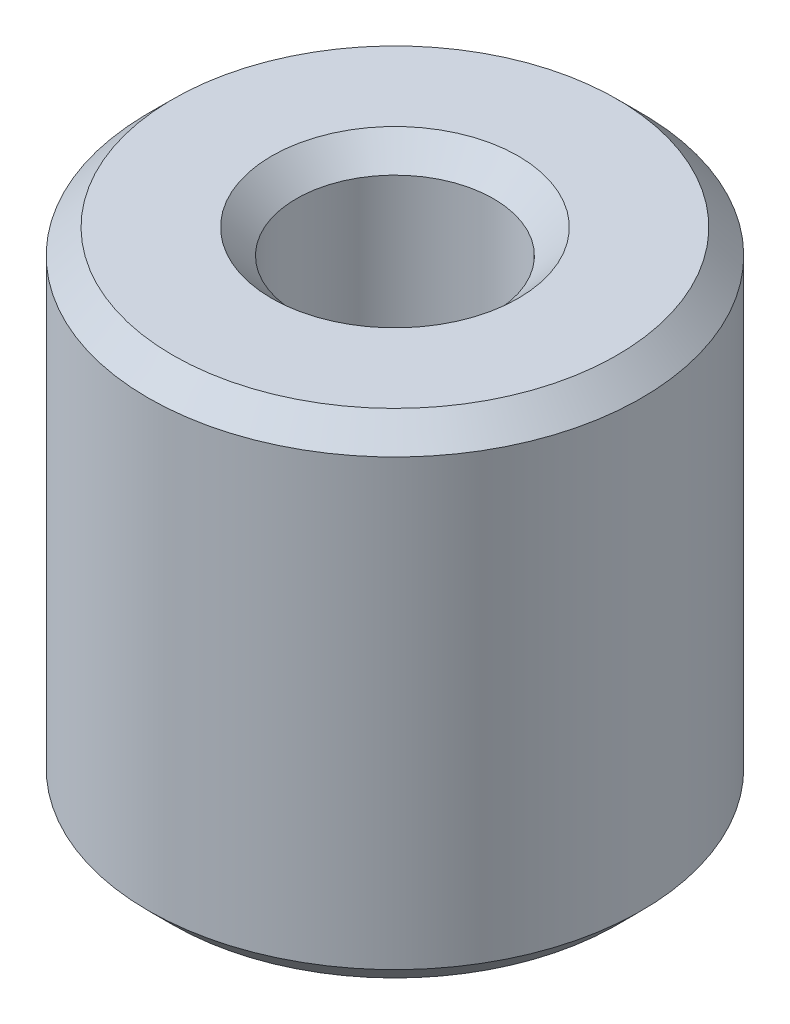
ISO-10303-21;
HEADER;
FILE_DESCRIPTION(('STEP AP214'),'2;1');
FILE_NAME('part.step','',(''),(''),'','','');
FILE_SCHEMA(('AUTOMOTIVE_DESIGN { 1 0 10303 214 1 1 1 1 }'));
ENDSEC;
DATA;
#1=APPLICATION_CONTEXT('core data for automotive mechanical design processes');
#2=APPLICATION_PROTOCOL_DEFINITION('international standard','automotive_design',2000,#1);
#3=PRODUCT_CONTEXT('',#1,'mechanical');
#4=PRODUCT('Part','Part','',(#3));
#5=PRODUCT_RELATED_PRODUCT_CATEGORY('part','',(#4));
#6=PRODUCT_DEFINITION_FORMATION('','',#4);
#7=PRODUCT_DEFINITION_CONTEXT('part definition',#1,'design');
#8=PRODUCT_DEFINITION('design','',#6,#7);
#9=PRODUCT_DEFINITION_SHAPE('','',#8);
#10=(LENGTH_UNIT() NAMED_UNIT(*) SI_UNIT(.MILLI.,.METRE.));
#11=(NAMED_UNIT(*) PLANE_ANGLE_UNIT() SI_UNIT($,.RADIAN.));
#12=(NAMED_UNIT(*) SI_UNIT($,.STERADIAN.) SOLID_ANGLE_UNIT());
#13=UNCERTAINTY_MEASURE_WITH_UNIT(LENGTH_MEASURE(1.E-05),#10,'distance_accuracy_value','');
#14=(GEOMETRIC_REPRESENTATION_CONTEXT(3) GLOBAL_UNCERTAINTY_ASSIGNED_CONTEXT((#13)) GLOBAL_UNIT_ASSIGNED_CONTEXT((#10,
#11,#12)) REPRESENTATION_CONTEXT('',''));
#15=CARTESIAN_POINT('',(0.,0.,0.));
#16=DIRECTION('',(0.,0.,1.));
#17=DIRECTION('',(1.,0.,0.));
#18=AXIS2_PLACEMENT_3D('',#15,#16,#17);
#19=CARTESIAN_POINT('',(0.,8.,0.));
#20=DIRECTION('',(0.,1.,0.));
#21=DIRECTION('',(0.,0.,1.));
#22=AXIS2_PLACEMENT_3D('',#19,#20,#21);
#23=PLANE('',#22);
#24=CARTESIAN_POINT('',(0.,8.,0.));
#25=DIRECTION('',(0.,1.,0.));
#26=DIRECTION('',(0.,0.,1.));
#27=AXIS2_PLACEMENT_3D('',#24,#25,#26);
#28=CIRCLE('',#27,2.);
#29=CARTESIAN_POINT('',(0.,8.,2.));
#30=VERTEX_POINT('',#29);
#31=EDGE_CURVE('E10',#30,#30,#28,.F.);
#32=ORIENTED_EDGE('',*,*,#31,.T.);
#33=EDGE_LOOP('',(#32));
#34=FACE_BOUND('',#33,.T.);
#35=CARTESIAN_POINT('',(0.,8.,0.));
#36=DIRECTION('',(0.,1.,0.));
#37=DIRECTION('',(0.,0.,1.));
#38=AXIS2_PLACEMENT_3D('',#35,#36,#37);
#39=CIRCLE('',#38,3.6);
#40=CARTESIAN_POINT('',(0.,8.,3.6));
#41=VERTEX_POINT('',#40);
#42=EDGE_CURVE('E43',#41,#41,#39,.T.);
#43=ORIENTED_EDGE('',*,*,#42,.T.);
#44=EDGE_LOOP('',(#43));
#45=FACE_BOUND('',#44,.T.);
#46=ADVANCED_FACE('F35',(#34,#45),#23,.T.);
#47=CARTESIAN_POINT('',(0.,0.,0.));
#48=DIRECTION('',(0.,1.,0.));
#49=DIRECTION('',(0.,0.,1.));
#50=AXIS2_PLACEMENT_3D('',#47,#48,#49);
#51=PLANE('',#50);
#52=CARTESIAN_POINT('',(0.,0.,0.));
#53=DIRECTION('',(0.,1.,0.));
#54=DIRECTION('',(0.,0.,1.));
#55=AXIS2_PLACEMENT_3D('',#52,#53,#54);
#56=CIRCLE('',#55,2.);
#57=CARTESIAN_POINT('',(0.,0.,2.));
#58=VERTEX_POINT('',#57);
#59=EDGE_CURVE('E62',#58,#58,#56,.T.);
#60=ORIENTED_EDGE('',*,*,#59,.T.);
#61=EDGE_LOOP('',(#60));
#62=FACE_BOUND('',#61,.T.);
#63=CARTESIAN_POINT('',(0.,0.,0.));
#64=DIRECTION('',(0.,1.,0.));
#65=DIRECTION('',(0.,0.,1.));
#66=AXIS2_PLACEMENT_3D('',#63,#64,#65);
#67=CIRCLE('',#66,3.6);
#68=CARTESIAN_POINT('',(0.,0.,3.6));
#69=VERTEX_POINT('',#68);
#70=EDGE_CURVE('E65',#69,#69,#67,.F.);
#71=ORIENTED_EDGE('',*,*,#70,.T.);
#72=EDGE_LOOP('',(#71));
#73=FACE_BOUND('',#72,.T.);
#74=ADVANCED_FACE('F69',(#62,#73),#51,.F.);
#75=CARTESIAN_POINT('',(0.,8.,0.));
#76=DIRECTION('',(0.,-1.,0.));
#77=DIRECTION('',(0.,0.,-1.));
#78=AXIS2_PLACEMENT_3D('',#75,#76,#77);
#79=CYLINDRICAL_SURFACE('',#78,4.);
#80=CARTESIAN_POINT('',(0.,0.399999999999998,0.));
#81=DIRECTION('',(0.,1.,0.));
#82=DIRECTION('',(0.,0.,1.));
#83=AXIS2_PLACEMENT_3D('',#80,#81,#82);
#84=CIRCLE('',#83,4.);
#85=CARTESIAN_POINT('',(0.,0.399999999999998,4.));
#86=VERTEX_POINT('',#85);
#87=EDGE_CURVE('E47',#86,#86,#84,.T.);
#88=ORIENTED_EDGE('',*,*,#87,.T.);
#89=EDGE_LOOP('',(#88));
#90=FACE_BOUND('',#89,.T.);
#91=CARTESIAN_POINT('',(0.,7.6,0.));
#92=DIRECTION('',(0.,1.,0.));
#93=DIRECTION('',(0.,0.,1.));
#94=AXIS2_PLACEMENT_3D('',#91,#92,#93);
#95=CIRCLE('',#94,4.);
#96=CARTESIAN_POINT('',(0.,7.6,4.));
#97=VERTEX_POINT('',#96);
#98=EDGE_CURVE('E51',#97,#97,#95,.F.);
#99=ORIENTED_EDGE('',*,*,#98,.T.);
#100=EDGE_LOOP('',(#99));
#101=FACE_BOUND('',#100,.T.);
#102=ADVANCED_FACE('F79',(#90,#101),#79,.T.);
#103=CARTESIAN_POINT('',(0.,8.,0.));
#104=DIRECTION('',(0.,-1.,0.));
#105=DIRECTION('',(0.,0.,-1.));
#106=AXIS2_PLACEMENT_3D('',#103,#104,#105);
#107=CYLINDRICAL_SURFACE('',#106,1.6);
#108=CARTESIAN_POINT('',(0.,0.400000000000002,0.));
#109=DIRECTION('',(0.,1.,0.));
#110=DIRECTION('',(0.,0.,1.));
#111=AXIS2_PLACEMENT_3D('',#108,#109,#110);
#112=CIRCLE('',#111,1.6);
#113=CARTESIAN_POINT('',(0.,0.400000000000002,1.6));
#114=VERTEX_POINT('',#113);
#115=EDGE_CURVE('E56',#114,#114,#112,.F.);
#116=ORIENTED_EDGE('',*,*,#115,.T.);
#117=EDGE_LOOP('',(#116));
#118=FACE_BOUND('',#117,.T.);
#119=CARTESIAN_POINT('',(0.,7.6,0.));
#120=DIRECTION('',(0.,1.,0.));
#121=DIRECTION('',(0.,0.,1.));
#122=AXIS2_PLACEMENT_3D('',#119,#120,#121);
#123=CIRCLE('',#122,1.6);
#124=CARTESIAN_POINT('',(0.,7.6,1.6));
#125=VERTEX_POINT('',#124);
#126=EDGE_CURVE('E59',#125,#125,#123,.T.);
#127=ORIENTED_EDGE('',*,*,#126,.T.);
#128=EDGE_LOOP('',(#127));
#129=FACE_BOUND('',#128,.T.);
#130=ADVANCED_FACE('F82',(#118,#129),#107,.F.);
#131=CARTESIAN_POINT('',(0.,0.,0.));
#132=DIRECTION('',(0.,-1.,0.));
#133=DIRECTION('',(0.,0.,-1.));
#134=AXIS2_PLACEMENT_3D('',#131,#132,#133);
#135=CONICAL_SURFACE('',#134,2.,0.785398163397444);
#136=ORIENTED_EDGE('',*,*,#115,.F.);
#137=EDGE_LOOP('',(#136));
#138=FACE_BOUND('',#137,.T.);
#139=ORIENTED_EDGE('',*,*,#59,.F.);
#140=EDGE_LOOP('',(#139));
#141=FACE_BOUND('',#140,.T.);
#142=ADVANCED_FACE('F75',(#138,#141),#135,.F.);
#143=CARTESIAN_POINT('',(0.,0.399999999999998,0.));
#144=DIRECTION('',(0.,1.,0.));
#145=DIRECTION('',(0.,0.,1.));
#146=AXIS2_PLACEMENT_3D('',#143,#144,#145);
#147=CONICAL_SURFACE('',#146,4.,0.785398163397452);
#148=ORIENTED_EDGE('',*,*,#70,.F.);
#149=EDGE_LOOP('',(#148));
#150=FACE_BOUND('',#149,.T.);
#151=ORIENTED_EDGE('',*,*,#87,.F.);
#152=EDGE_LOOP('',(#151));
#153=FACE_BOUND('',#152,.T.);
#154=ADVANCED_FACE('F71',(#150,#153),#147,.T.);
#155=CARTESIAN_POINT('',(0.,7.6,0.));
#156=DIRECTION('',(0.,1.,0.));
#157=DIRECTION('',(0.,0.,1.));
#158=AXIS2_PLACEMENT_3D('',#155,#156,#157);
#159=CONICAL_SURFACE('',#158,1.6,0.785398163397451);
#160=CARTESIAN_POINT('',(0.,8.,2.));
#161=CARTESIAN_POINT('',(0.,7.99583333333333,1.99583333333333));
#162=CARTESIAN_POINT('',(0.,7.99166666666667,1.99166666666667));
#163=CARTESIAN_POINT('',(0.,7.98333333333333,1.98333333333333));
#164=CARTESIAN_POINT('',(0.,7.97916666666667,1.97916666666667));
#165=CARTESIAN_POINT('',(0.,7.97083333333333,1.97083333333333));
#166=CARTESIAN_POINT('',(0.,7.96666666666667,1.96666666666667));
#167=CARTESIAN_POINT('',(0.,7.95833333333333,1.95833333333333));
#168=CARTESIAN_POINT('',(0.,7.95416666666666,1.95416666666667));
#169=CARTESIAN_POINT('',(0.,7.94583333333333,1.94583333333333));
#170=CARTESIAN_POINT('',(0.,7.94166666666667,1.94166666666667));
#171=CARTESIAN_POINT('',(0.,7.93333333333333,1.93333333333333));
#172=CARTESIAN_POINT('',(0.,7.92916666666667,1.92916666666667));
#173=CARTESIAN_POINT('',(0.,7.92083333333333,1.92083333333333));
#174=CARTESIAN_POINT('',(0.,7.91666666666667,1.91666666666667));
#175=CARTESIAN_POINT('',(0.,7.90833333333333,1.90833333333333));
#176=CARTESIAN_POINT('',(0.,7.90416666666667,1.90416666666667));
#177=CARTESIAN_POINT('',(0.,7.89583333333333,1.89583333333333));
#178=CARTESIAN_POINT('',(0.,7.89166666666666,1.89166666666667));
#179=CARTESIAN_POINT('',(0.,7.88333333333333,1.88333333333333));
#180=CARTESIAN_POINT('',(0.,7.87916666666667,1.87916666666667));
#181=CARTESIAN_POINT('',(0.,7.87083333333333,1.87083333333333));
#182=CARTESIAN_POINT('',(0.,7.86666666666667,1.86666666666667));
#183=CARTESIAN_POINT('',(0.,7.85833333333333,1.85833333333333));
#184=CARTESIAN_POINT('',(0.,7.85416666666667,1.85416666666667));
#185=CARTESIAN_POINT('',(0.,7.84583333333333,1.84583333333333));
#186=CARTESIAN_POINT('',(0.,7.84166666666667,1.84166666666667));
#187=CARTESIAN_POINT('',(0.,7.83333333333333,1.83333333333333));
#188=CARTESIAN_POINT('',(0.,7.82916666666667,1.82916666666667));
#189=CARTESIAN_POINT('',(0.,7.82083333333333,1.82083333333333));
#190=CARTESIAN_POINT('',(0.,7.81666666666667,1.81666666666667));
#191=CARTESIAN_POINT('',(0.,7.80833333333333,1.80833333333333));
#192=CARTESIAN_POINT('',(0.,7.80416666666667,1.80416666666667));
#193=CARTESIAN_POINT('',(0.,7.79583333333333,1.79583333333333));
#194=CARTESIAN_POINT('',(0.,7.79166666666667,1.79166666666667));
#195=CARTESIAN_POINT('',(0.,7.78333333333333,1.78333333333333));
#196=CARTESIAN_POINT('',(0.,7.77916666666667,1.77916666666667));
#197=CARTESIAN_POINT('',(0.,7.77083333333333,1.77083333333333));
#198=CARTESIAN_POINT('',(0.,7.76666666666667,1.76666666666667));
#199=CARTESIAN_POINT('',(0.,7.75833333333333,1.75833333333333));
#200=CARTESIAN_POINT('',(0.,7.75416666666667,1.75416666666667));
#201=CARTESIAN_POINT('',(0.,7.74583333333333,1.74583333333333));
#202=CARTESIAN_POINT('',(0.,7.74166666666667,1.74166666666667));
#203=CARTESIAN_POINT('',(0.,7.73333333333333,1.73333333333333));
#204=CARTESIAN_POINT('',(0.,7.72916666666667,1.72916666666667));
#205=CARTESIAN_POINT('',(0.,7.72083333333333,1.72083333333333));
#206=CARTESIAN_POINT('',(0.,7.71666666666667,1.71666666666667));
#207=CARTESIAN_POINT('',(0.,7.70833333333333,1.70833333333333));
#208=CARTESIAN_POINT('',(0.,7.70416666666667,1.70416666666667));
#209=CARTESIAN_POINT('',(0.,7.69583333333333,1.69583333333333));
#210=CARTESIAN_POINT('',(0.,7.69166666666667,1.69166666666667));
#211=CARTESIAN_POINT('',(0.,7.68333333333333,1.68333333333333));
#212=CARTESIAN_POINT('',(0.,7.67916666666667,1.67916666666667));
#213=CARTESIAN_POINT('',(0.,7.67083333333333,1.67083333333333));
#214=CARTESIAN_POINT('',(0.,7.66666666666667,1.66666666666667));
#215=CARTESIAN_POINT('',(0.,7.65833333333333,1.65833333333333));
#216=CARTESIAN_POINT('',(0.,7.65416666666667,1.65416666666667));
#217=CARTESIAN_POINT('',(0.,7.64583333333333,1.64583333333333));
#218=CARTESIAN_POINT('',(0.,7.64166666666667,1.64166666666667));
#219=CARTESIAN_POINT('',(0.,7.63333333333333,1.63333333333333));
#220=CARTESIAN_POINT('',(0.,7.62916666666667,1.62916666666667));
#221=CARTESIAN_POINT('',(0.,7.62083333333333,1.62083333333333));
#222=CARTESIAN_POINT('',(0.,7.61666666666667,1.61666666666667));
#223=CARTESIAN_POINT('',(0.,7.60833333333333,1.60833333333333));
#224=CARTESIAN_POINT('',(0.,7.60416666666667,1.60416666666667));
#225=CARTESIAN_POINT('',(0.,7.6,1.6));
#226=B_SPLINE_CURVE_WITH_KNOTS('',3,(#160,#161,#162,#163,#164,#165,#166,#167,#168,#169,#170,
#171,#172,#173,#174,#175,#176,#177,#178,#179,#180,#181,#182,#183,#184,#185,#186,#187,#188,#189,
#190,#191,#192,#193,#194,#195,#196,#197,#198,#199,#200,#201,#202,#203,#204,#205,#206,#207,#208,
#209,#210,#211,#212,#213,#214,#215,#216,#217,#218,#219,#220,#221,#222,#223,#224,#225),
.UNSPECIFIED.,.F.,.F.,(4,2,2,2,2,2,2,2,2,2,2,2,2,2,2,2,2,2,2,2,2,2,2,2,2,2,2,2,2,2,2,2,4),(0.,
0.0176776695296627,0.0353553390593269,0.0530330085889907,0.0707106781186546,0.0883883476483174,
0.106066017177981,0.123743686707645,0.141421356237309,0.159099025766973,0.176776695296636,
0.1944543648263,0.212132034355964,0.229809703885628,0.247487373415291,0.265165042944955,
0.282842712474619,0.300520382004282,0.318198051533946,0.335875721063609,0.353553390593273,
0.371231060122937,0.388908729652601,0.406586399182265,0.424264068711928,0.441941738241592,
0.459619407771255,0.477297077300919,0.494974746830583,0.512652416360246,0.53033008588991,
0.548007755419574,0.565685424949237),.UNSPECIFIED.);
#227=EDGE_CURVE('BSEAM74',#30,#125,#226,.T.);
#228=ORIENTED_EDGE('',*,*,#31,.F.);
#229=ORIENTED_EDGE('',*,*,#126,.F.);
#230=ORIENTED_EDGE('',*,*,#227,.T.);
#231=ORIENTED_EDGE('',*,*,#227,.F.);
#232=EDGE_LOOP('',(#228,#230,#229,#231));
#233=FACE_BOUND('',#232,.T.);
#234=ADVANCED_FACE('F74',(#233),#159,.F.);
#235=CARTESIAN_POINT('',(0.,8.,0.));
#236=DIRECTION('',(0.,-1.,0.));
#237=DIRECTION('',(0.,0.,-1.));
#238=AXIS2_PLACEMENT_3D('',#235,#236,#237);
#239=CONICAL_SURFACE('',#238,3.6,0.785398163397448);
#240=ORIENTED_EDGE('',*,*,#98,.F.);
#241=EDGE_LOOP('',(#240));
#242=FACE_BOUND('',#241,.T.);
#243=ORIENTED_EDGE('',*,*,#42,.F.);
#244=EDGE_LOOP('',(#243));
#245=FACE_BOUND('',#244,.T.);
#246=ADVANCED_FACE('F38',(#242,#245),#239,.T.);
#247=CLOSED_SHELL('',(#46,#74,#102,#130,#142,#154,#234,#246));
#248=MANIFOLD_SOLID_BREP('B2',#247);
#249=ADVANCED_BREP_SHAPE_REPRESENTATION('',(#18,#248),#14);
#250=SHAPE_DEFINITION_REPRESENTATION(#9,#249);
ENDSEC;
END-ISO-10303-21;
